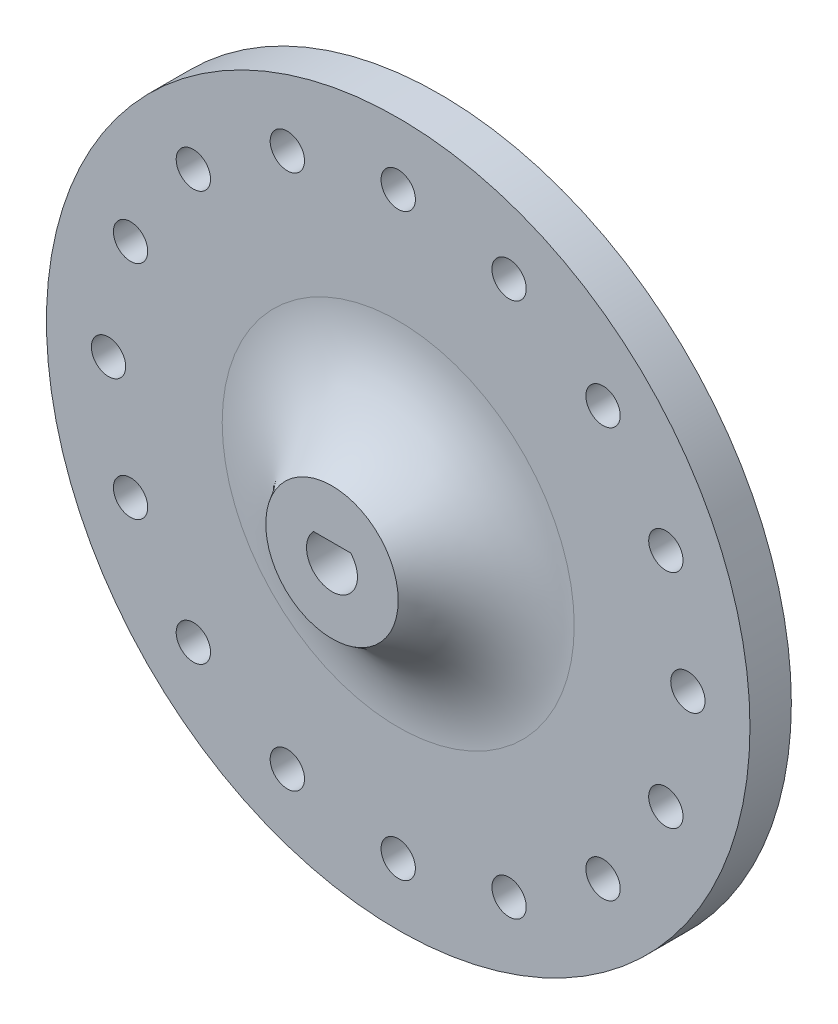
ISO-10303-21;
HEADER;
FILE_DESCRIPTION(('STEP AP214'),'2;1');
FILE_NAME('part.step','',(''),(''),'','','');
FILE_SCHEMA(('AUTOMOTIVE_DESIGN { 1 0 10303 214 1 1 1 1 }'));
ENDSEC;
DATA;
#1=APPLICATION_CONTEXT('core data for automotive mechanical design processes');
#2=APPLICATION_PROTOCOL_DEFINITION('international standard','automotive_design',2000,#1);
#3=PRODUCT_CONTEXT('',#1,'mechanical');
#4=PRODUCT('Part','Part','',(#3));
#5=PRODUCT_RELATED_PRODUCT_CATEGORY('part','',(#4));
#6=PRODUCT_DEFINITION_FORMATION('','',#4);
#7=PRODUCT_DEFINITION_CONTEXT('part definition',#1,'design');
#8=PRODUCT_DEFINITION('design','',#6,#7);
#9=PRODUCT_DEFINITION_SHAPE('','',#8);
#10=(LENGTH_UNIT() NAMED_UNIT(*) SI_UNIT(.MILLI.,.METRE.));
#11=(NAMED_UNIT(*) PLANE_ANGLE_UNIT() SI_UNIT($,.RADIAN.));
#12=(NAMED_UNIT(*) SI_UNIT($,.STERADIAN.) SOLID_ANGLE_UNIT());
#13=UNCERTAINTY_MEASURE_WITH_UNIT(LENGTH_MEASURE(1.E-05),#10,'distance_accuracy_value','');
#14=(GEOMETRIC_REPRESENTATION_CONTEXT(3) GLOBAL_UNCERTAINTY_ASSIGNED_CONTEXT((#13)) GLOBAL_UNIT_ASSIGNED_CONTEXT((#10,
#11,#12)) REPRESENTATION_CONTEXT('',''));
#15=CARTESIAN_POINT('',(0.,0.,0.));
#16=DIRECTION('',(0.,0.,1.));
#17=DIRECTION('',(1.,0.,0.));
#18=AXIS2_PLACEMENT_3D('',#15,#16,#17);
#19=CARTESIAN_POINT('',(0.,0.,5.));
#20=DIRECTION('',(0.,0.,-1.));
#21=DIRECTION('',(-1.,0.,0.));
#22=AXIS2_PLACEMENT_3D('',#19,#20,#21);
#23=CYLINDRICAL_SURFACE('',#22,42.5);
#24=CARTESIAN_POINT('',(0.,0.,5.));
#25=DIRECTION('',(0.,0.,1.));
#26=DIRECTION('',(1.,0.,0.));
#27=AXIS2_PLACEMENT_3D('',#24,#25,#26);
#28=CIRCLE('',#27,42.5);
#29=CARTESIAN_POINT('',(42.5,0.,5.));
#30=VERTEX_POINT('',#29);
#31=EDGE_CURVE('E42',#30,#30,#28,.T.);
#32=ORIENTED_EDGE('',*,*,#31,.F.);
#33=EDGE_LOOP('',(#32));
#34=FACE_BOUND('',#33,.T.);
#35=CARTESIAN_POINT('',(0.,0.,0.));
#36=DIRECTION('',(0.,0.,1.));
#37=DIRECTION('',(1.,0.,0.));
#38=AXIS2_PLACEMENT_3D('',#35,#36,#37);
#39=CIRCLE('',#38,42.5);
#40=CARTESIAN_POINT('',(42.5,0.,0.));
#41=VERTEX_POINT('',#40);
#42=EDGE_CURVE('E179',#41,#41,#39,.T.);
#43=ORIENTED_EDGE('',*,*,#42,.T.);
#44=EDGE_LOOP('',(#43));
#45=FACE_BOUND('',#44,.T.);
#46=ADVANCED_FACE('F34',(#34,#45),#23,.T.);
#47=CARTESIAN_POINT('',(0.,0.,5.));
#48=DIRECTION('',(0.,0.,1.));
#49=DIRECTION('',(1.,0.,0.));
#50=AXIS2_PLACEMENT_3D('',#47,#48,#49);
#51=PLANE('',#50);
#52=CARTESIAN_POINT('',(24.7487373415292,24.7487373415291,5.));
#53=DIRECTION('',(0.,0.,1.));
#54=DIRECTION('',(0.707106781186546,-0.707106781186549,0.));
#55=AXIS2_PLACEMENT_3D('',#52,#53,#54);
#56=CIRCLE('',#55,2.075);
#57=CARTESIAN_POINT('',(26.2159839124913,23.281490770567,5.));
#58=VERTEX_POINT('',#57);
#59=EDGE_CURVE('E118',#58,#58,#56,.T.);
#60=ORIENTED_EDGE('',*,*,#59,.F.);
#61=EDGE_LOOP('',(#60));
#62=FACE_BOUND('',#61,.T.);
#63=CARTESIAN_POINT('',(32.3357836378951,13.3939201327781,5.));
#64=DIRECTION('',(0.,0.,1.));
#65=DIRECTION('',(0.382683432365087,-0.923879532511288,0.));
#66=AXIS2_PLACEMENT_3D('',#63,#64,#65);
#67=CIRCLE('',#66,2.075);
#68=CARTESIAN_POINT('',(33.1298517600526,11.4768701028171,5.));
#69=VERTEX_POINT('',#68);
#70=EDGE_CURVE('E124',#69,#69,#67,.T.);
#71=ORIENTED_EDGE('',*,*,#70,.F.);
#72=EDGE_LOOP('',(#71));
#73=FACE_BOUND('',#72,.T.);
#74=CARTESIAN_POINT('',(35.,-1.2220184685951E-13,5.));
#75=DIRECTION('',(0.,0.,1.));
#76=DIRECTION('',(0.,-1.,0.));
#77=AXIS2_PLACEMENT_3D('',#74,#75,#76);
#78=CIRCLE('',#77,2.075);
#79=CARTESIAN_POINT('',(35.,-2.07500000000012,5.));
#80=VERTEX_POINT('',#79);
#81=EDGE_CURVE('E130',#80,#80,#78,.T.);
#82=ORIENTED_EDGE('',*,*,#81,.F.);
#83=EDGE_LOOP('',(#82));
#84=FACE_BOUND('',#83,.T.);
#85=CARTESIAN_POINT('',(32.335783637895,-13.3939201327783,5.));
#86=DIRECTION('',(0.,0.,1.));
#87=DIRECTION('',(-0.382683432365094,-0.923879532511285,0.));
#88=AXIS2_PLACEMENT_3D('',#85,#86,#87);
#89=CIRCLE('',#88,2.075);
#90=CARTESIAN_POINT('',(31.5417155157374,-15.3109701627392,5.));
#91=VERTEX_POINT('',#90);
#92=EDGE_CURVE('E136',#91,#91,#89,.T.);
#93=ORIENTED_EDGE('',*,*,#92,.F.);
#94=EDGE_LOOP('',(#93));
#95=FACE_BOUND('',#94,.T.);
#96=CARTESIAN_POINT('',(24.748737341529,-24.7487373415293,5.));
#97=DIRECTION('',(0.,0.,1.));
#98=DIRECTION('',(-0.707106781186551,-0.707106781186544,0.));
#99=AXIS2_PLACEMENT_3D('',#96,#97,#98);
#100=CIRCLE('',#99,2.075);
#101=CARTESIAN_POINT('',(23.2814907705669,-26.2159839124914,5.));
#102=VERTEX_POINT('',#101);
#103=EDGE_CURVE('E142',#102,#102,#100,.T.);
#104=ORIENTED_EDGE('',*,*,#103,.F.);
#105=EDGE_LOOP('',(#104));
#106=FACE_BOUND('',#105,.T.);
#107=CARTESIAN_POINT('',(13.3939201327779,-32.3357836378951,5.));
#108=DIRECTION('',(0.,0.,1.));
#109=DIRECTION('',(-0.923879532511289,-0.382683432365084,0.));
#110=AXIS2_PLACEMENT_3D('',#107,#108,#109);
#111=CIRCLE('',#110,2.075);
#112=CARTESIAN_POINT('',(11.476870102817,-33.1298517600527,5.));
#113=VERTEX_POINT('',#112);
#114=EDGE_CURVE('E148',#113,#113,#111,.T.);
#115=ORIENTED_EDGE('',*,*,#114,.F.);
#116=EDGE_LOOP('',(#115));
#117=FACE_BOUND('',#116,.T.);
#118=CARTESIAN_POINT('',(0.,-35.,5.));
#119=DIRECTION('',(0.,0.,1.));
#120=DIRECTION('',(-1.,0.,0.));
#121=AXIS2_PLACEMENT_3D('',#118,#119,#120);
#122=CIRCLE('',#121,2.075);
#123=CARTESIAN_POINT('',(-2.075,-35.,5.));
#124=VERTEX_POINT('',#123);
#125=EDGE_CURVE('E154',#124,#124,#122,.T.);
#126=ORIENTED_EDGE('',*,*,#125,.F.);
#127=EDGE_LOOP('',(#126));
#128=FACE_BOUND('',#127,.T.);
#129=CARTESIAN_POINT('',(-13.3939201327784,-32.3357836378949,5.));
#130=DIRECTION('',(0.,0.,1.));
#131=DIRECTION('',(-0.923879532511284,0.382683432365097,0.));
#132=AXIS2_PLACEMENT_3D('',#129,#130,#131);
#133=CIRCLE('',#132,2.075);
#134=CARTESIAN_POINT('',(-15.3109701627393,-31.5417155157374,5.));
#135=VERTEX_POINT('',#134);
#136=EDGE_CURVE('E81',#135,#135,#133,.T.);
#137=ORIENTED_EDGE('',*,*,#136,.F.);
#138=EDGE_LOOP('',(#137));
#139=FACE_BOUND('',#138,.T.);
#140=CARTESIAN_POINT('',(-24.7487373415294,-24.748737341529,5.));
#141=DIRECTION('',(0.,0.,1.));
#142=DIRECTION('',(-0.707106781186541,0.707106781186554,0.));
#143=AXIS2_PLACEMENT_3D('',#140,#141,#142);
#144=CIRCLE('',#143,2.075);
#145=CARTESIAN_POINT('',(-26.2159839124915,-23.2814907705669,5.));
#146=VERTEX_POINT('',#145);
#147=EDGE_CURVE('E82',#146,#146,#144,.T.);
#148=ORIENTED_EDGE('',*,*,#147,.F.);
#149=EDGE_LOOP('',(#148));
#150=FACE_BOUND('',#149,.T.);
#151=CARTESIAN_POINT('',(-32.3357836378952,-13.3939201327778,5.));
#152=DIRECTION('',(0.,0.,1.));
#153=DIRECTION('',(-0.382683432365081,0.923879532511291,0.));
#154=AXIS2_PLACEMENT_3D('',#151,#152,#153);
#155=CIRCLE('',#154,2.075);
#156=CARTESIAN_POINT('',(-33.1298517600527,-11.4768701028169,5.));
#157=VERTEX_POINT('',#156);
#158=EDGE_CURVE('E88',#157,#157,#155,.T.);
#159=ORIENTED_EDGE('',*,*,#158,.F.);
#160=EDGE_LOOP('',(#159));
#161=FACE_BOUND('',#160,.T.);
#162=CARTESIAN_POINT('',(-35.,3.66605540578529E-13,5.));
#163=DIRECTION('',(0.,0.,1.));
#164=DIRECTION('',(0.,1.,0.));
#165=AXIS2_PLACEMENT_3D('',#162,#163,#164);
#166=CIRCLE('',#165,2.075);
#167=CARTESIAN_POINT('',(-35.,2.07500000000037,5.));
#168=VERTEX_POINT('',#167);
#169=EDGE_CURVE('E94',#168,#168,#166,.T.);
#170=ORIENTED_EDGE('',*,*,#169,.F.);
#171=EDGE_LOOP('',(#170));
#172=FACE_BOUND('',#171,.T.);
#173=CARTESIAN_POINT('',(-32.3357836378949,13.3939201327785,5.));
#174=DIRECTION('',(0.,0.,1.));
#175=DIRECTION('',(0.3826834323651,0.923879532511283,0.));
#176=AXIS2_PLACEMENT_3D('',#173,#174,#175);
#177=CIRCLE('',#176,2.075);
#178=CARTESIAN_POINT('',(-31.5417155157373,15.3109701627394,5.));
#179=VERTEX_POINT('',#178);
#180=EDGE_CURVE('E100',#179,#179,#177,.T.);
#181=ORIENTED_EDGE('',*,*,#180,.F.);
#182=EDGE_LOOP('',(#181));
#183=FACE_BOUND('',#182,.T.);
#184=CARTESIAN_POINT('',(-24.7487373415289,24.7487373415295,5.));
#185=DIRECTION('',(0.,0.,1.));
#186=DIRECTION('',(0.707106781186556,0.707106781186539,0.));
#187=AXIS2_PLACEMENT_3D('',#184,#185,#186);
#188=CIRCLE('',#187,2.075);
#189=CARTESIAN_POINT('',(-23.2814907705668,26.2159839124915,5.));
#190=VERTEX_POINT('',#189);
#191=EDGE_CURVE('E106',#190,#190,#188,.T.);
#192=ORIENTED_EDGE('',*,*,#191,.F.);
#193=EDGE_LOOP('',(#192));
#194=FACE_BOUND('',#193,.T.);
#195=CARTESIAN_POINT('',(-13.3939201327777,32.3357836378952,5.));
#196=DIRECTION('',(0.,0.,1.));
#197=DIRECTION('',(0.923879532511292,0.382683432365077,0.));
#198=AXIS2_PLACEMENT_3D('',#195,#196,#197);
#199=CIRCLE('',#198,2.075);
#200=CARTESIAN_POINT('',(-11.4768701028168,33.1298517600528,5.));
#201=VERTEX_POINT('',#200);
#202=EDGE_CURVE('E72',#201,#201,#199,.T.);
#203=ORIENTED_EDGE('',*,*,#202,.F.);
#204=EDGE_LOOP('',(#203));
#205=FACE_BOUND('',#204,.T.);
#206=CARTESIAN_POINT('',(13.3939201327782,32.335783637895,5.));
#207=DIRECTION('',(0.,0.,1.));
#208=DIRECTION('',(0.923879532511287,-0.382683432365091,0.));
#209=AXIS2_PLACEMENT_3D('',#206,#207,#208);
#210=CIRCLE('',#209,2.075);
#211=CARTESIAN_POINT('',(15.3109701627391,31.5417155157375,5.));
#212=VERTEX_POINT('',#211);
#213=EDGE_CURVE('E117',#212,#212,#210,.T.);
#214=ORIENTED_EDGE('',*,*,#213,.F.);
#215=EDGE_LOOP('',(#214));
#216=FACE_BOUND('',#215,.T.);
#217=CARTESIAN_POINT('',(0.,35.,5.));
#218=DIRECTION('',(0.,0.,1.));
#219=DIRECTION('',(1.,0.,0.));
#220=AXIS2_PLACEMENT_3D('',#217,#218,#219);
#221=CIRCLE('',#220,2.075);
#222=CARTESIAN_POINT('',(2.075,35.,5.));
#223=VERTEX_POINT('',#222);
#224=EDGE_CURVE('E165',#223,#223,#221,.T.);
#225=ORIENTED_EDGE('',*,*,#224,.F.);
#226=EDGE_LOOP('',(#225));
#227=FACE_BOUND('',#226,.T.);
#228=CARTESIAN_POINT('',(0.,0.,5.));
#229=DIRECTION('',(0.,0.,1.));
#230=DIRECTION('',(1.,0.,0.));
#231=AXIS2_PLACEMENT_3D('',#228,#229,#230);
#232=CIRCLE('',#231,21.2664991614216);
#233=CARTESIAN_POINT('',(21.2664991614216,0.,5.));
#234=VERTEX_POINT('',#233);
#235=EDGE_CURVE('E11',#234,#234,#232,.F.);
#236=ORIENTED_EDGE('',*,*,#235,.T.);
#237=EDGE_LOOP('',(#236));
#238=FACE_BOUND('',#237,.T.);
#239=ORIENTED_EDGE('',*,*,#31,.T.);
#240=EDGE_LOOP('',(#239));
#241=FACE_BOUND('',#240,.T.);
#242=ADVANCED_FACE('F187',(#62,#73,#84,#95,#106,#117,#128,#139,#150,#161,#172,#183,#194,#205,
#216,#227,#238,#241),#51,.T.);
#243=CARTESIAN_POINT('',(0.,0.,0.));
#244=DIRECTION('',(0.,0.,1.));
#245=DIRECTION('',(1.,0.,0.));
#246=AXIS2_PLACEMENT_3D('',#243,#244,#245);
#247=PLANE('',#246);
#248=DIRECTION('',(-1.,0.,0.));
#249=VECTOR('',#248,1.);
#250=CARTESIAN_POINT('',(2.24624686978079,2.1,0.));
#251=LINE('',#250,#249);
#252=CARTESIAN_POINT('',(2.24624686978079,2.1,0.));
#253=VERTEX_POINT('',#252);
#254=CARTESIAN_POINT('',(-2.24624686978079,2.1,0.));
#255=VERTEX_POINT('',#254);
#256=EDGE_CURVE('E69',#253,#255,#251,.T.);
#257=ORIENTED_EDGE('',*,*,#256,.T.);
#258=CARTESIAN_POINT('',(0.,0.,0.));
#259=DIRECTION('',(0.,0.,1.));
#260=DIRECTION('',(1.,0.,0.));
#261=AXIS2_PLACEMENT_3D('',#258,#259,#260);
#262=CIRCLE('',#261,3.075);
#263=EDGE_CURVE('E62',#255,#253,#262,.T.);
#264=ORIENTED_EDGE('',*,*,#263,.T.);
#265=EDGE_LOOP('',(#257,#264));
#266=FACE_BOUND('',#265,.T.);
#267=CARTESIAN_POINT('',(24.7487373415292,24.7487373415291,0.));
#268=DIRECTION('',(0.,0.,1.));
#269=DIRECTION('',(0.707106781186546,-0.707106781186549,0.));
#270=AXIS2_PLACEMENT_3D('',#267,#268,#269);
#271=CIRCLE('',#270,2.075);
#272=CARTESIAN_POINT('',(26.2159839124913,23.281490770567,0.));
#273=VERTEX_POINT('',#272);
#274=EDGE_CURVE('E114',#273,#273,#271,.T.);
#275=ORIENTED_EDGE('',*,*,#274,.T.);
#276=EDGE_LOOP('',(#275));
#277=FACE_BOUND('',#276,.T.);
#278=CARTESIAN_POINT('',(32.3357836378951,13.3939201327781,0.));
#279=DIRECTION('',(0.,0.,1.));
#280=DIRECTION('',(0.382683432365087,-0.923879532511288,0.));
#281=AXIS2_PLACEMENT_3D('',#278,#279,#280);
#282=CIRCLE('',#281,2.075);
#283=CARTESIAN_POINT('',(33.1298517600526,11.4768701028171,0.));
#284=VERTEX_POINT('',#283);
#285=EDGE_CURVE('E121',#284,#284,#282,.T.);
#286=ORIENTED_EDGE('',*,*,#285,.T.);
#287=EDGE_LOOP('',(#286));
#288=FACE_BOUND('',#287,.T.);
#289=CARTESIAN_POINT('',(35.,-1.2220184685951E-13,0.));
#290=DIRECTION('',(0.,0.,1.));
#291=DIRECTION('',(0.,-1.,0.));
#292=AXIS2_PLACEMENT_3D('',#289,#290,#291);
#293=CIRCLE('',#292,2.075);
#294=CARTESIAN_POINT('',(35.,-2.07500000000012,0.));
#295=VERTEX_POINT('',#294);
#296=EDGE_CURVE('E127',#295,#295,#293,.T.);
#297=ORIENTED_EDGE('',*,*,#296,.T.);
#298=EDGE_LOOP('',(#297));
#299=FACE_BOUND('',#298,.T.);
#300=CARTESIAN_POINT('',(32.335783637895,-13.3939201327783,0.));
#301=DIRECTION('',(0.,0.,1.));
#302=DIRECTION('',(-0.382683432365094,-0.923879532511285,0.));
#303=AXIS2_PLACEMENT_3D('',#300,#301,#302);
#304=CIRCLE('',#303,2.075);
#305=CARTESIAN_POINT('',(31.5417155157374,-15.3109701627392,0.));
#306=VERTEX_POINT('',#305);
#307=EDGE_CURVE('E133',#306,#306,#304,.T.);
#308=ORIENTED_EDGE('',*,*,#307,.T.);
#309=EDGE_LOOP('',(#308));
#310=FACE_BOUND('',#309,.T.);
#311=CARTESIAN_POINT('',(24.748737341529,-24.7487373415293,0.));
#312=DIRECTION('',(0.,0.,1.));
#313=DIRECTION('',(-0.707106781186551,-0.707106781186544,0.));
#314=AXIS2_PLACEMENT_3D('',#311,#312,#313);
#315=CIRCLE('',#314,2.075);
#316=CARTESIAN_POINT('',(23.2814907705669,-26.2159839124914,0.));
#317=VERTEX_POINT('',#316);
#318=EDGE_CURVE('E139',#317,#317,#315,.T.);
#319=ORIENTED_EDGE('',*,*,#318,.T.);
#320=EDGE_LOOP('',(#319));
#321=FACE_BOUND('',#320,.T.);
#322=CARTESIAN_POINT('',(13.3939201327779,-32.3357836378951,0.));
#323=DIRECTION('',(0.,0.,1.));
#324=DIRECTION('',(-0.923879532511289,-0.382683432365084,0.));
#325=AXIS2_PLACEMENT_3D('',#322,#323,#324);
#326=CIRCLE('',#325,2.075);
#327=CARTESIAN_POINT('',(11.476870102817,-33.1298517600527,0.));
#328=VERTEX_POINT('',#327);
#329=EDGE_CURVE('E145',#328,#328,#326,.T.);
#330=ORIENTED_EDGE('',*,*,#329,.T.);
#331=EDGE_LOOP('',(#330));
#332=FACE_BOUND('',#331,.T.);
#333=CARTESIAN_POINT('',(0.,-35.,0.));
#334=DIRECTION('',(0.,0.,1.));
#335=DIRECTION('',(-1.,0.,0.));
#336=AXIS2_PLACEMENT_3D('',#333,#334,#335);
#337=CIRCLE('',#336,2.075);
#338=CARTESIAN_POINT('',(-2.075,-35.,0.));
#339=VERTEX_POINT('',#338);
#340=EDGE_CURVE('E151',#339,#339,#337,.T.);
#341=ORIENTED_EDGE('',*,*,#340,.T.);
#342=EDGE_LOOP('',(#341));
#343=FACE_BOUND('',#342,.T.);
#344=CARTESIAN_POINT('',(-13.3939201327784,-32.3357836378949,0.));
#345=DIRECTION('',(0.,0.,1.));
#346=DIRECTION('',(-0.923879532511284,0.382683432365097,0.));
#347=AXIS2_PLACEMENT_3D('',#344,#345,#346);
#348=CIRCLE('',#347,2.075);
#349=CARTESIAN_POINT('',(-15.3109701627393,-31.5417155157374,0.));
#350=VERTEX_POINT('',#349);
#351=EDGE_CURVE('E157',#350,#350,#348,.T.);
#352=ORIENTED_EDGE('',*,*,#351,.T.);
#353=EDGE_LOOP('',(#352));
#354=FACE_BOUND('',#353,.T.);
#355=CARTESIAN_POINT('',(-24.7487373415294,-24.748737341529,0.));
#356=DIRECTION('',(0.,0.,1.));
#357=DIRECTION('',(-0.707106781186541,0.707106781186554,0.));
#358=AXIS2_PLACEMENT_3D('',#355,#356,#357);
#359=CIRCLE('',#358,2.075);
#360=CARTESIAN_POINT('',(-26.2159839124915,-23.2814907705669,0.));
#361=VERTEX_POINT('',#360);
#362=EDGE_CURVE('E78',#361,#361,#359,.T.);
#363=ORIENTED_EDGE('',*,*,#362,.T.);
#364=EDGE_LOOP('',(#363));
#365=FACE_BOUND('',#364,.T.);
#366=CARTESIAN_POINT('',(-32.3357836378952,-13.3939201327778,0.));
#367=DIRECTION('',(0.,0.,1.));
#368=DIRECTION('',(-0.382683432365081,0.923879532511291,0.));
#369=AXIS2_PLACEMENT_3D('',#366,#367,#368);
#370=CIRCLE('',#369,2.075);
#371=CARTESIAN_POINT('',(-33.1298517600527,-11.4768701028169,0.));
#372=VERTEX_POINT('',#371);
#373=EDGE_CURVE('E85',#372,#372,#370,.T.);
#374=ORIENTED_EDGE('',*,*,#373,.T.);
#375=EDGE_LOOP('',(#374));
#376=FACE_BOUND('',#375,.T.);
#377=CARTESIAN_POINT('',(-35.,3.66605540578529E-13,0.));
#378=DIRECTION('',(0.,0.,1.));
#379=DIRECTION('',(0.,1.,0.));
#380=AXIS2_PLACEMENT_3D('',#377,#378,#379);
#381=CIRCLE('',#380,2.075);
#382=CARTESIAN_POINT('',(-35.,2.07500000000037,0.));
#383=VERTEX_POINT('',#382);
#384=EDGE_CURVE('E91',#383,#383,#381,.T.);
#385=ORIENTED_EDGE('',*,*,#384,.T.);
#386=EDGE_LOOP('',(#385));
#387=FACE_BOUND('',#386,.T.);
#388=CARTESIAN_POINT('',(-32.3357836378949,13.3939201327785,0.));
#389=DIRECTION('',(0.,0.,1.));
#390=DIRECTION('',(0.3826834323651,0.923879532511283,0.));
#391=AXIS2_PLACEMENT_3D('',#388,#389,#390);
#392=CIRCLE('',#391,2.075);
#393=CARTESIAN_POINT('',(-31.5417155157373,15.3109701627394,0.));
#394=VERTEX_POINT('',#393);
#395=EDGE_CURVE('E97',#394,#394,#392,.T.);
#396=ORIENTED_EDGE('',*,*,#395,.T.);
#397=EDGE_LOOP('',(#396));
#398=FACE_BOUND('',#397,.T.);
#399=CARTESIAN_POINT('',(-24.7487373415289,24.7487373415295,0.));
#400=DIRECTION('',(0.,0.,1.));
#401=DIRECTION('',(0.707106781186556,0.707106781186539,0.));
#402=AXIS2_PLACEMENT_3D('',#399,#400,#401);
#403=CIRCLE('',#402,2.075);
#404=CARTESIAN_POINT('',(-23.2814907705668,26.2159839124915,0.));
#405=VERTEX_POINT('',#404);
#406=EDGE_CURVE('E103',#405,#405,#403,.T.);
#407=ORIENTED_EDGE('',*,*,#406,.T.);
#408=EDGE_LOOP('',(#407));
#409=FACE_BOUND('',#408,.T.);
#410=CARTESIAN_POINT('',(-13.3939201327777,32.3357836378952,0.));
#411=DIRECTION('',(0.,0.,1.));
#412=DIRECTION('',(0.923879532511292,0.382683432365077,0.));
#413=AXIS2_PLACEMENT_3D('',#410,#411,#412);
#414=CIRCLE('',#413,2.075);
#415=CARTESIAN_POINT('',(-11.4768701028168,33.1298517600528,0.));
#416=VERTEX_POINT('',#415);
#417=EDGE_CURVE('E109',#416,#416,#414,.T.);
#418=ORIENTED_EDGE('',*,*,#417,.T.);
#419=EDGE_LOOP('',(#418));
#420=FACE_BOUND('',#419,.T.);
#421=CARTESIAN_POINT('',(13.3939201327782,32.335783637895,0.));
#422=DIRECTION('',(0.,0.,1.));
#423=DIRECTION('',(0.923879532511287,-0.382683432365091,0.));
#424=AXIS2_PLACEMENT_3D('',#421,#422,#423);
#425=CIRCLE('',#424,2.075);
#426=CARTESIAN_POINT('',(15.3109701627391,31.5417155157375,0.));
#427=VERTEX_POINT('',#426);
#428=EDGE_CURVE('E162',#427,#427,#425,.T.);
#429=ORIENTED_EDGE('',*,*,#428,.T.);
#430=EDGE_LOOP('',(#429));
#431=FACE_BOUND('',#430,.T.);
#432=CARTESIAN_POINT('',(0.,35.,0.));
#433=DIRECTION('',(0.,0.,1.));
#434=DIRECTION('',(1.,0.,0.));
#435=AXIS2_PLACEMENT_3D('',#432,#433,#434);
#436=CIRCLE('',#435,2.075);
#437=CARTESIAN_POINT('',(2.075,35.,0.));
#438=VERTEX_POINT('',#437);
#439=EDGE_CURVE('E168',#438,#438,#436,.T.);
#440=ORIENTED_EDGE('',*,*,#439,.T.);
#441=EDGE_LOOP('',(#440));
#442=FACE_BOUND('',#441,.T.);
#443=ORIENTED_EDGE('',*,*,#42,.F.);
#444=EDGE_LOOP('',(#443));
#445=FACE_BOUND('',#444,.T.);
#446=ADVANCED_FACE('F74',(#266,#277,#288,#299,#310,#321,#332,#343,#354,#365,#376,#387,#398,#409,
#420,#431,#442,#445),#247,.F.);
#447=CARTESIAN_POINT('',(0.,0.,13.));
#448=DIRECTION('',(0.,0.,1.));
#449=DIRECTION('',(1.,0.,0.));
#450=AXIS2_PLACEMENT_3D('',#447,#448,#449);
#451=PLANE('',#450);
#452=CARTESIAN_POINT('',(0.,0.,13.));
#453=DIRECTION('',(0.,0.,1.));
#454=DIRECTION('',(1.,0.,0.));
#455=AXIS2_PLACEMENT_3D('',#452,#453,#454);
#456=CIRCLE('',#455,8.);
#457=CARTESIAN_POINT('',(8.,0.,13.));
#458=VERTEX_POINT('',#457);
#459=EDGE_CURVE('E67',#458,#458,#456,.T.);
#460=ORIENTED_EDGE('',*,*,#459,.T.);
#461=EDGE_LOOP('',(#460));
#462=FACE_BOUND('',#461,.T.);
#463=DIRECTION('',(-1.,0.,0.));
#464=VECTOR('',#463,1.);
#465=CARTESIAN_POINT('',(-2.24624686978079,2.1,13.));
#466=LINE('',#465,#464);
#467=CARTESIAN_POINT('',(2.24624686978079,2.1,13.));
#468=VERTEX_POINT('',#467);
#469=CARTESIAN_POINT('',(-2.24624686978079,2.1,13.));
#470=VERTEX_POINT('',#469);
#471=EDGE_CURVE('E174',#468,#470,#466,.T.);
#472=ORIENTED_EDGE('',*,*,#471,.F.);
#473=CARTESIAN_POINT('',(0.,0.,13.));
#474=DIRECTION('',(0.,0.,1.));
#475=DIRECTION('',(1.,0.,0.));
#476=AXIS2_PLACEMENT_3D('',#473,#474,#475);
#477=CIRCLE('',#476,3.075);
#478=EDGE_CURVE('E65',#470,#468,#477,.T.);
#479=ORIENTED_EDGE('',*,*,#478,.F.);
#480=EDGE_LOOP('',(#472,#479));
#481=FACE_BOUND('',#480,.T.);
#482=ADVANCED_FACE('F186',(#462,#481),#451,.T.);
#483=CARTESIAN_POINT('',(0.,0.,13.));
#484=DIRECTION('',(0.,0.,-1.));
#485=DIRECTION('',(-1.,0.,0.));
#486=AXIS2_PLACEMENT_3D('',#483,#484,#485);
#487=CYLINDRICAL_SURFACE('',#486,3.075);
#488=DIRECTION('',(0.,0.,-1.));
#489=VECTOR('',#488,1.);
#490=CARTESIAN_POINT('',(2.24624686978079,2.1,13.));
#491=LINE('',#490,#489);
#492=EDGE_CURVE('E54',#468,#253,#491,.T.);
#493=ORIENTED_EDGE('',*,*,#492,.T.);
#494=ORIENTED_EDGE('',*,*,#263,.F.);
#495=DIRECTION('',(0.,0.,-1.));
#496=VECTOR('',#495,1.);
#497=CARTESIAN_POINT('',(-2.24624686978079,2.1,13.));
#498=LINE('',#497,#496);
#499=EDGE_CURVE('E49',#470,#255,#498,.T.);
#500=ORIENTED_EDGE('',*,*,#499,.F.);
#501=ORIENTED_EDGE('',*,*,#478,.T.);
#502=EDGE_LOOP('',(#493,#494,#500,#501));
#503=FACE_BOUND('',#502,.T.);
#504=ADVANCED_FACE('F60',(#503),#487,.F.);
#505=CARTESIAN_POINT('',(-2.24624686978079,2.1,13.));
#506=DIRECTION('',(0.,-1.,0.));
#507=DIRECTION('',(0.,0.,-1.));
#508=AXIS2_PLACEMENT_3D('',#505,#506,#507);
#509=PLANE('',#508);
#510=ORIENTED_EDGE('',*,*,#499,.T.);
#511=ORIENTED_EDGE('',*,*,#256,.F.);
#512=ORIENTED_EDGE('',*,*,#492,.F.);
#513=ORIENTED_EDGE('',*,*,#471,.T.);
#514=EDGE_LOOP('',(#510,#511,#512,#513));
#515=FACE_BOUND('',#514,.T.);
#516=ADVANCED_FACE('F70',(#515),#509,.T.);
#517=CARTESIAN_POINT('',(0.,0.,20.));
#518=DIRECTION('',(0.,0.,1.));
#519=DIRECTION('',(1.,0.,0.));
#520=AXIS2_PLACEMENT_3D('',#517,#518,#519);
#521=TOROIDAL_SURFACE('',#520,21.2664991614216,15.);
#522=ORIENTED_EDGE('',*,*,#235,.F.);
#523=EDGE_LOOP('',(#522));
#524=FACE_BOUND('',#523,.T.);
#525=ORIENTED_EDGE('',*,*,#459,.F.);
#526=EDGE_LOOP('',(#525));
#527=FACE_BOUND('',#526,.T.);
#528=ADVANCED_FACE('F36',(#524,#527),#521,.F.);
#529=CARTESIAN_POINT('',(0.,35.,0.));
#530=DIRECTION('',(0.,0.,1.));
#531=DIRECTION('',(1.,0.,0.));
#532=AXIS2_PLACEMENT_3D('',#529,#530,#531);
#533=CYLINDRICAL_SURFACE('',#532,2.075);
#534=ORIENTED_EDGE('',*,*,#439,.F.);
#535=EDGE_LOOP('',(#534));
#536=FACE_BOUND('',#535,.T.);
#537=ORIENTED_EDGE('',*,*,#224,.T.);
#538=EDGE_LOOP('',(#537));
#539=FACE_BOUND('',#538,.T.);
#540=ADVANCED_FACE('F215',(#536,#539),#533,.F.);
#541=CARTESIAN_POINT('',(13.3939201327782,32.335783637895,0.));
#542=DIRECTION('',(0.,0.,1.));
#543=DIRECTION('',(1.,0.,0.));
#544=AXIS2_PLACEMENT_3D('',#541,#542,#543);
#545=CYLINDRICAL_SURFACE('',#544,2.075);
#546=ORIENTED_EDGE('',*,*,#428,.F.);
#547=EDGE_LOOP('',(#546));
#548=FACE_BOUND('',#547,.T.);
#549=ORIENTED_EDGE('',*,*,#213,.T.);
#550=EDGE_LOOP('',(#549));
#551=FACE_BOUND('',#550,.T.);
#552=ADVANCED_FACE('F220',(#548,#551),#545,.F.);
#553=CARTESIAN_POINT('',(-13.3939201327777,32.3357836378952,0.));
#554=DIRECTION('',(0.,0.,1.));
#555=DIRECTION('',(1.,0.,0.));
#556=AXIS2_PLACEMENT_3D('',#553,#554,#555);
#557=CYLINDRICAL_SURFACE('',#556,2.075);
#558=ORIENTED_EDGE('',*,*,#417,.F.);
#559=EDGE_LOOP('',(#558));
#560=FACE_BOUND('',#559,.T.);
#561=ORIENTED_EDGE('',*,*,#202,.T.);
#562=EDGE_LOOP('',(#561));
#563=FACE_BOUND('',#562,.T.);
#564=ADVANCED_FACE('F225',(#560,#563),#557,.F.);
#565=CARTESIAN_POINT('',(-24.7487373415289,24.7487373415295,0.));
#566=DIRECTION('',(0.,0.,1.));
#567=DIRECTION('',(1.,0.,0.));
#568=AXIS2_PLACEMENT_3D('',#565,#566,#567);
#569=CYLINDRICAL_SURFACE('',#568,2.075);
#570=ORIENTED_EDGE('',*,*,#406,.F.);
#571=EDGE_LOOP('',(#570));
#572=FACE_BOUND('',#571,.T.);
#573=ORIENTED_EDGE('',*,*,#191,.T.);
#574=EDGE_LOOP('',(#573));
#575=FACE_BOUND('',#574,.T.);
#576=ADVANCED_FACE('F235',(#572,#575),#569,.F.);
#577=CARTESIAN_POINT('',(-32.3357836378949,13.3939201327785,0.));
#578=DIRECTION('',(0.,0.,1.));
#579=DIRECTION('',(1.,0.,0.));
#580=AXIS2_PLACEMENT_3D('',#577,#578,#579);
#581=CYLINDRICAL_SURFACE('',#580,2.075);
#582=ORIENTED_EDGE('',*,*,#395,.F.);
#583=EDGE_LOOP('',(#582));
#584=FACE_BOUND('',#583,.T.);
#585=ORIENTED_EDGE('',*,*,#180,.T.);
#586=EDGE_LOOP('',(#585));
#587=FACE_BOUND('',#586,.T.);
#588=ADVANCED_FACE('F245',(#584,#587),#581,.F.);
#589=CARTESIAN_POINT('',(-35.,3.66605540578529E-13,0.));
#590=DIRECTION('',(0.,0.,1.));
#591=DIRECTION('',(1.,0.,0.));
#592=AXIS2_PLACEMENT_3D('',#589,#590,#591);
#593=CYLINDRICAL_SURFACE('',#592,2.075);
#594=ORIENTED_EDGE('',*,*,#384,.F.);
#595=EDGE_LOOP('',(#594));
#596=FACE_BOUND('',#595,.T.);
#597=ORIENTED_EDGE('',*,*,#169,.T.);
#598=EDGE_LOOP('',(#597));
#599=FACE_BOUND('',#598,.T.);
#600=ADVANCED_FACE('F255',(#596,#599),#593,.F.);
#601=CARTESIAN_POINT('',(-32.3357836378952,-13.3939201327778,0.));
#602=DIRECTION('',(0.,0.,1.));
#603=DIRECTION('',(1.,0.,0.));
#604=AXIS2_PLACEMENT_3D('',#601,#602,#603);
#605=CYLINDRICAL_SURFACE('',#604,2.075);
#606=ORIENTED_EDGE('',*,*,#373,.F.);
#607=EDGE_LOOP('',(#606));
#608=FACE_BOUND('',#607,.T.);
#609=ORIENTED_EDGE('',*,*,#158,.T.);
#610=EDGE_LOOP('',(#609));
#611=FACE_BOUND('',#610,.T.);
#612=ADVANCED_FACE('F265',(#608,#611),#605,.F.);
#613=CARTESIAN_POINT('',(-24.7487373415294,-24.748737341529,0.));
#614=DIRECTION('',(0.,0.,1.));
#615=DIRECTION('',(1.,0.,0.));
#616=AXIS2_PLACEMENT_3D('',#613,#614,#615);
#617=CYLINDRICAL_SURFACE('',#616,2.075);
#618=ORIENTED_EDGE('',*,*,#362,.F.);
#619=EDGE_LOOP('',(#618));
#620=FACE_BOUND('',#619,.T.);
#621=ORIENTED_EDGE('',*,*,#147,.T.);
#622=EDGE_LOOP('',(#621));
#623=FACE_BOUND('',#622,.T.);
#624=ADVANCED_FACE('F275',(#620,#623),#617,.F.);
#625=CARTESIAN_POINT('',(-13.3939201327784,-32.3357836378949,0.));
#626=DIRECTION('',(0.,0.,1.));
#627=DIRECTION('',(1.,0.,0.));
#628=AXIS2_PLACEMENT_3D('',#625,#626,#627);
#629=CYLINDRICAL_SURFACE('',#628,2.075);
#630=ORIENTED_EDGE('',*,*,#351,.F.);
#631=EDGE_LOOP('',(#630));
#632=FACE_BOUND('',#631,.T.);
#633=ORIENTED_EDGE('',*,*,#136,.T.);
#634=EDGE_LOOP('',(#633));
#635=FACE_BOUND('',#634,.T.);
#636=ADVANCED_FACE('F285',(#632,#635),#629,.F.);
#637=CARTESIAN_POINT('',(0.,-35.,0.));
#638=DIRECTION('',(0.,0.,1.));
#639=DIRECTION('',(1.,0.,0.));
#640=AXIS2_PLACEMENT_3D('',#637,#638,#639);
#641=CYLINDRICAL_SURFACE('',#640,2.075);
#642=ORIENTED_EDGE('',*,*,#340,.F.);
#643=EDGE_LOOP('',(#642));
#644=FACE_BOUND('',#643,.T.);
#645=ORIENTED_EDGE('',*,*,#125,.T.);
#646=EDGE_LOOP('',(#645));
#647=FACE_BOUND('',#646,.T.);
#648=ADVANCED_FACE('F295',(#644,#647),#641,.F.);
#649=CARTESIAN_POINT('',(13.3939201327779,-32.3357836378951,0.));
#650=DIRECTION('',(0.,0.,1.));
#651=DIRECTION('',(1.,0.,0.));
#652=AXIS2_PLACEMENT_3D('',#649,#650,#651);
#653=CYLINDRICAL_SURFACE('',#652,2.075);
#654=ORIENTED_EDGE('',*,*,#329,.F.);
#655=EDGE_LOOP('',(#654));
#656=FACE_BOUND('',#655,.T.);
#657=ORIENTED_EDGE('',*,*,#114,.T.);
#658=EDGE_LOOP('',(#657));
#659=FACE_BOUND('',#658,.T.);
#660=ADVANCED_FACE('F305',(#656,#659),#653,.F.);
#661=CARTESIAN_POINT('',(24.748737341529,-24.7487373415293,0.));
#662=DIRECTION('',(0.,0.,1.));
#663=DIRECTION('',(1.,0.,0.));
#664=AXIS2_PLACEMENT_3D('',#661,#662,#663);
#665=CYLINDRICAL_SURFACE('',#664,2.075);
#666=ORIENTED_EDGE('',*,*,#318,.F.);
#667=EDGE_LOOP('',(#666));
#668=FACE_BOUND('',#667,.T.);
#669=ORIENTED_EDGE('',*,*,#103,.T.);
#670=EDGE_LOOP('',(#669));
#671=FACE_BOUND('',#670,.T.);
#672=ADVANCED_FACE('F315',(#668,#671),#665,.F.);
#673=CARTESIAN_POINT('',(32.335783637895,-13.3939201327783,0.));
#674=DIRECTION('',(0.,0.,1.));
#675=DIRECTION('',(1.,0.,0.));
#676=AXIS2_PLACEMENT_3D('',#673,#674,#675);
#677=CYLINDRICAL_SURFACE('',#676,2.075);
#678=ORIENTED_EDGE('',*,*,#307,.F.);
#679=EDGE_LOOP('',(#678));
#680=FACE_BOUND('',#679,.T.);
#681=ORIENTED_EDGE('',*,*,#92,.T.);
#682=EDGE_LOOP('',(#681));
#683=FACE_BOUND('',#682,.T.);
#684=ADVANCED_FACE('F325',(#680,#683),#677,.F.);
#685=CARTESIAN_POINT('',(35.,-1.2220184685951E-13,0.));
#686=DIRECTION('',(0.,0.,1.));
#687=DIRECTION('',(1.,0.,0.));
#688=AXIS2_PLACEMENT_3D('',#685,#686,#687);
#689=CYLINDRICAL_SURFACE('',#688,2.075);
#690=ORIENTED_EDGE('',*,*,#296,.F.);
#691=EDGE_LOOP('',(#690));
#692=FACE_BOUND('',#691,.T.);
#693=ORIENTED_EDGE('',*,*,#81,.T.);
#694=EDGE_LOOP('',(#693));
#695=FACE_BOUND('',#694,.T.);
#696=ADVANCED_FACE('F335',(#692,#695),#689,.F.);
#697=CARTESIAN_POINT('',(32.3357836378951,13.3939201327781,0.));
#698=DIRECTION('',(0.,0.,1.));
#699=DIRECTION('',(1.,0.,0.));
#700=AXIS2_PLACEMENT_3D('',#697,#698,#699);
#701=CYLINDRICAL_SURFACE('',#700,2.075);
#702=ORIENTED_EDGE('',*,*,#285,.F.);
#703=EDGE_LOOP('',(#702));
#704=FACE_BOUND('',#703,.T.);
#705=ORIENTED_EDGE('',*,*,#70,.T.);
#706=EDGE_LOOP('',(#705));
#707=FACE_BOUND('',#706,.T.);
#708=ADVANCED_FACE('F345',(#704,#707),#701,.F.);
#709=CARTESIAN_POINT('',(24.7487373415292,24.7487373415291,0.));
#710=DIRECTION('',(0.,0.,1.));
#711=DIRECTION('',(1.,0.,0.));
#712=AXIS2_PLACEMENT_3D('',#709,#710,#711);
#713=CYLINDRICAL_SURFACE('',#712,2.075);
#714=ORIENTED_EDGE('',*,*,#274,.F.);
#715=EDGE_LOOP('',(#714));
#716=FACE_BOUND('',#715,.T.);
#717=ORIENTED_EDGE('',*,*,#59,.T.);
#718=EDGE_LOOP('',(#717));
#719=FACE_BOUND('',#718,.T.);
#720=ADVANCED_FACE('F355',(#716,#719),#713,.F.);
#721=CLOSED_SHELL('',(#46,#242,#446,#482,#504,#516,#528,#540,#552,#564,#576,#588,#600,#612,#624,
#636,#648,#660,#672,#684,#696,#708,#720));
#722=MANIFOLD_SOLID_BREP('B2',#721);
#723=ADVANCED_BREP_SHAPE_REPRESENTATION('',(#18,#722),#14);
#724=SHAPE_DEFINITION_REPRESENTATION(#9,#723);
ENDSEC;
END-ISO-10303-21;
